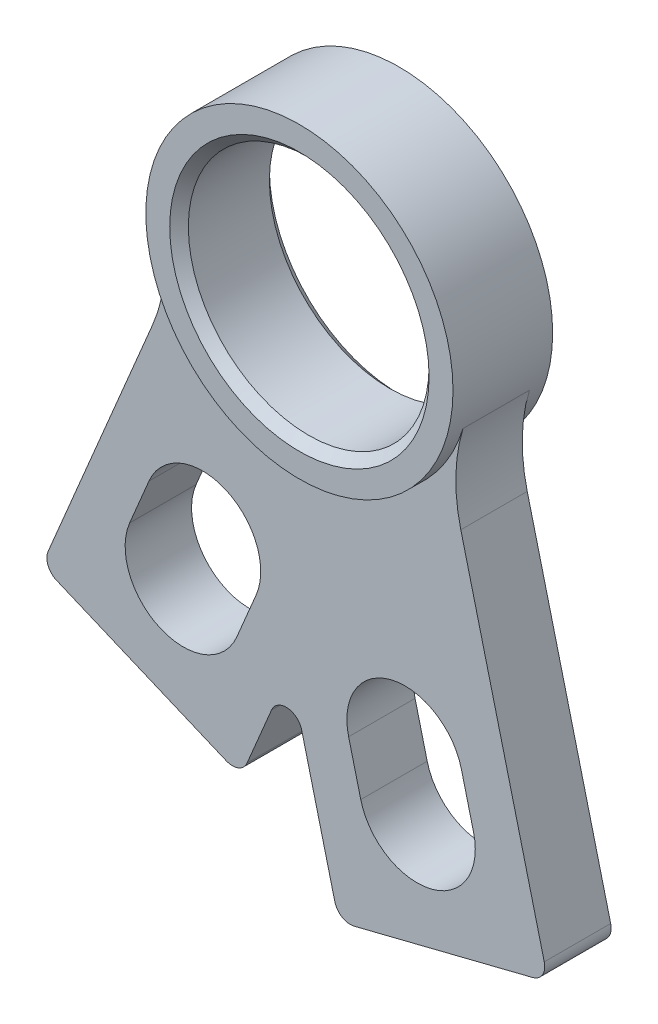
ISO-10303-21;
HEADER;
FILE_DESCRIPTION(('STEP AP214'),'2;1');
FILE_NAME('part.step','',(''),(''),'','','');
FILE_SCHEMA(('AUTOMOTIVE_DESIGN { 1 0 10303 214 1 1 1 1 }'));
ENDSEC;
DATA;
#1=APPLICATION_CONTEXT('core data for automotive mechanical design processes');
#2=APPLICATION_PROTOCOL_DEFINITION('international standard','automotive_design',2000,#1);
#3=PRODUCT_CONTEXT('',#1,'mechanical');
#4=PRODUCT('Part','Part','',(#3));
#5=PRODUCT_RELATED_PRODUCT_CATEGORY('part','',(#4));
#6=PRODUCT_DEFINITION_FORMATION('','',#4);
#7=PRODUCT_DEFINITION_CONTEXT('part definition',#1,'design');
#8=PRODUCT_DEFINITION('design','',#6,#7);
#9=PRODUCT_DEFINITION_SHAPE('','',#8);
#10=(LENGTH_UNIT() NAMED_UNIT(*) SI_UNIT(.MILLI.,.METRE.));
#11=(NAMED_UNIT(*) PLANE_ANGLE_UNIT() SI_UNIT($,.RADIAN.));
#12=(NAMED_UNIT(*) SI_UNIT($,.STERADIAN.) SOLID_ANGLE_UNIT());
#13=UNCERTAINTY_MEASURE_WITH_UNIT(LENGTH_MEASURE(1.E-05),#10,'distance_accuracy_value','');
#14=(GEOMETRIC_REPRESENTATION_CONTEXT(3) GLOBAL_UNCERTAINTY_ASSIGNED_CONTEXT((#13)) GLOBAL_UNIT_ASSIGNED_CONTEXT((#10,
#11,#12)) REPRESENTATION_CONTEXT('',''));
#15=CARTESIAN_POINT('',(0.,0.,0.));
#16=DIRECTION('',(0.,0.,1.));
#17=DIRECTION('',(1.,0.,0.));
#18=AXIS2_PLACEMENT_3D('',#15,#16,#17);
#19=CARTESIAN_POINT('',(0.,0.,4.7625));
#20=DIRECTION('',(0.,0.,-1.));
#21=DIRECTION('',(-1.,0.,0.));
#22=AXIS2_PLACEMENT_3D('',#19,#20,#21);
#23=CYLINDRICAL_SURFACE('',#22,11.5062);
#24=CARTESIAN_POINT('',(0.,0.,-3.87350000000002));
#25=DIRECTION('',(0.,0.,1.));
#26=DIRECTION('',(1.,0.,0.));
#27=AXIS2_PLACEMENT_3D('',#24,#25,#26);
#28=CIRCLE('',#27,11.5062);
#29=CARTESIAN_POINT('',(-11.5062,0.,-3.87350000000002));
#30=VERTEX_POINT('',#29);
#31=EDGE_CURVE('E42',#30,#30,#28,.F.);
#32=CARTESIAN_POINT('',(0.,0.,3.87349999999996));
#33=DIRECTION('',(0.,0.,1.));
#34=DIRECTION('',(1.,0.,0.));
#35=AXIS2_PLACEMENT_3D('',#32,#33,#34);
#36=CIRCLE('',#35,11.5062);
#37=CARTESIAN_POINT('',(-11.5062,0.,3.87349999999996));
#38=VERTEX_POINT('',#37);
#39=EDGE_CURVE('E369',#38,#38,#36,.T.);
#40=CARTESIAN_POINT('',(-11.5062,0.,-3.87350000000002));
#41=CARTESIAN_POINT('',(-11.5062,0.,-3.79280208333335));
#42=CARTESIAN_POINT('',(-11.5062,0.,-3.71210416666669));
#43=CARTESIAN_POINT('',(-11.5062,0.,-3.55070833333335));
#44=CARTESIAN_POINT('',(-11.5062,0.,-3.47001041666669));
#45=CARTESIAN_POINT('',(-11.5062,0.,-3.30861458333335));
#46=CARTESIAN_POINT('',(-11.5062,0.,-3.22791666666669));
#47=CARTESIAN_POINT('',(-11.5062,0.,-3.06652083333336));
#48=CARTESIAN_POINT('',(-11.5062,0.,-2.98582291666669));
#49=CARTESIAN_POINT('',(-11.5062,0.,-2.82442708333336));
#50=CARTESIAN_POINT('',(-11.5062,0.,-2.74372916666669));
#51=CARTESIAN_POINT('',(-11.5062,0.,-2.58233333333336));
#52=CARTESIAN_POINT('',(-11.5062,0.,-2.50163541666669));
#53=CARTESIAN_POINT('',(-11.5062,0.,-2.34023958333336));
#54=CARTESIAN_POINT('',(-11.5062,0.,-2.25954166666669));
#55=CARTESIAN_POINT('',(-11.5062,0.,-2.09814583333336));
#56=CARTESIAN_POINT('',(-11.5062,0.,-2.01744791666669));
#57=CARTESIAN_POINT('',(-11.5062,0.,-1.85605208333336));
#58=CARTESIAN_POINT('',(-11.5062,0.,-1.77535416666669));
#59=CARTESIAN_POINT('',(-11.5062,0.,-1.61395833333336));
#60=CARTESIAN_POINT('',(-11.5062,0.,-1.53326041666669));
#61=CARTESIAN_POINT('',(-11.5062,0.,-1.37186458333336));
#62=CARTESIAN_POINT('',(-11.5062,0.,-1.29116666666669));
#63=CARTESIAN_POINT('',(-11.5062,0.,-1.12977083333336));
#64=CARTESIAN_POINT('',(-11.5062,0.,-1.04907291666669));
#65=CARTESIAN_POINT('',(-11.5062,0.,-0.88767708333336));
#66=CARTESIAN_POINT('',(-11.5062,0.,-0.806979166666694));
#67=CARTESIAN_POINT('',(-11.5062,0.,-0.645583333333361));
#68=CARTESIAN_POINT('',(-11.5062,0.,-0.564885416666694));
#69=CARTESIAN_POINT('',(-11.5062,0.,-0.403489583333361));
#70=CARTESIAN_POINT('',(-11.5062,0.,-0.322791666666695));
#71=CARTESIAN_POINT('',(-11.5062,0.,-0.161395833333361));
#72=CARTESIAN_POINT('',(-11.5062,0.,-0.080697916666695));
#73=CARTESIAN_POINT('',(-11.5062,0.,0.0806979166666378));
#74=CARTESIAN_POINT('',(-11.5062,0.,0.161395833333304));
#75=CARTESIAN_POINT('',(-11.5062,0.,0.322791666666637));
#76=CARTESIAN_POINT('',(-11.5062,0.,0.403489583333304));
#77=CARTESIAN_POINT('',(-11.5062,0.,0.564885416666637));
#78=CARTESIAN_POINT('',(-11.5062,0.,0.645583333333304));
#79=CARTESIAN_POINT('',(-11.5062,0.,0.806979166666636));
#80=CARTESIAN_POINT('',(-11.5062,0.,0.887677083333303));
#81=CARTESIAN_POINT('',(-11.5062,0.,1.04907291666664));
#82=CARTESIAN_POINT('',(-11.5062,0.,1.1297708333333));
#83=CARTESIAN_POINT('',(-11.5062,0.,1.29116666666664));
#84=CARTESIAN_POINT('',(-11.5062,0.,1.3718645833333));
#85=CARTESIAN_POINT('',(-11.5062,0.,1.53326041666663));
#86=CARTESIAN_POINT('',(-11.5062,0.,1.6139583333333));
#87=CARTESIAN_POINT('',(-11.5062,0.,1.77535416666663));
#88=CARTESIAN_POINT('',(-11.5062,0.,1.8560520833333));
#89=CARTESIAN_POINT('',(-11.5062,0.,2.01744791666663));
#90=CARTESIAN_POINT('',(-11.5062,0.,2.0981458333333));
#91=CARTESIAN_POINT('',(-11.5062,0.,2.25954166666663));
#92=CARTESIAN_POINT('',(-11.5062,0.,2.3402395833333));
#93=CARTESIAN_POINT('',(-11.5062,0.,2.50163541666663));
#94=CARTESIAN_POINT('',(-11.5062,0.,2.5823333333333));
#95=CARTESIAN_POINT('',(-11.5062,0.,2.74372916666663));
#96=CARTESIAN_POINT('',(-11.5062,0.,2.8244270833333));
#97=CARTESIAN_POINT('',(-11.5062,0.,2.98582291666663));
#98=CARTESIAN_POINT('',(-11.5062,0.,3.0665208333333));
#99=CARTESIAN_POINT('',(-11.5062,0.,3.22791666666663));
#100=CARTESIAN_POINT('',(-11.5062,0.,3.3086145833333));
#101=CARTESIAN_POINT('',(-11.5062,0.,3.47001041666663));
#102=CARTESIAN_POINT('',(-11.5062,0.,3.5507083333333));
#103=CARTESIAN_POINT('',(-11.5062,0.,3.71210416666663));
#104=CARTESIAN_POINT('',(-11.5062,0.,3.7928020833333));
#105=CARTESIAN_POINT('',(-11.5062,0.,3.87349999999996));
#106=B_SPLINE_CURVE_WITH_KNOTS('',3,(#40,#41,#42,#43,#44,#45,#46,#47,#48,#49,#50,#51,#52,#53,
#54,#55,#56,#57,#58,#59,#60,#61,#62,#63,#64,#65,#66,#67,#68,#69,#70,#71,#72,#73,#74,#75,#76,#77,
#78,#79,#80,#81,#82,#83,#84,#85,#86,#87,#88,#89,#90,#91,#92,#93,#94,#95,#96,#97,#98,#99,#100,
#101,#102,#103,#104,#105),.UNSPECIFIED.,.F.,.F.,(4,2,2,2,2,2,2,2,2,2,2,2,2,2,2,2,2,2,2,2,2,2,2,
2,2,2,2,2,2,2,2,2,4),(0.,0.24209375,0.484187499999998,0.726281249999999,0.968374999999997,
1.21046875,1.4525625,1.69465625,1.93674999999999,2.17884375,2.42093749999999,2.66303124999999,
2.90512499999999,3.14721874999999,3.38931249999999,3.63140624999999,3.87349999999999,
4.11559374999999,4.35768749999999,4.59978124999999,4.84187499999999,5.08396874999999,
5.32606249999999,5.56815624999999,5.81024999999999,6.05234374999999,6.29443749999999,
6.53653124999999,6.77862499999998,7.02071874999998,7.26281249999998,7.50490624999998,
7.74699999999998),.UNSPECIFIED.);
#107=EDGE_CURVE('BSEAM34',#30,#38,#106,.T.);
#108=ORIENTED_EDGE('',*,*,#31,.T.);
#109=ORIENTED_EDGE('',*,*,#39,.T.);
#110=ORIENTED_EDGE('',*,*,#107,.T.);
#111=ORIENTED_EDGE('',*,*,#107,.F.);
#112=EDGE_LOOP('',(#108,#110,#109,#111));
#113=FACE_BOUND('',#112,.T.);
#114=ADVANCED_FACE('F34',(#113),#23,.F.);
#115=CARTESIAN_POINT('',(0.,0.,4.7625));
#116=DIRECTION('',(0.,0.,-1.));
#117=DIRECTION('',(-1.,0.,0.));
#118=AXIS2_PLACEMENT_3D('',#115,#116,#117);
#119=CYLINDRICAL_SURFACE('',#118,14.6812);
#120=DIRECTION('',(0.,0.,-1.));
#121=VECTOR('',#120,1.);
#122=CARTESIAN_POINT('',(-14.532047586715,-2.08739703397579,3.175));
#123=LINE('',#122,#121);
#124=CARTESIAN_POINT('',(-14.532047586715,-2.0873970339758,3.175));
#125=VERTEX_POINT('',#124);
#126=CARTESIAN_POINT('',(-14.532047586715,-2.08739703397579,-3.175));
#127=VERTEX_POINT('',#126);
#128=EDGE_CURVE('E196',#125,#127,#123,.T.);
#129=ORIENTED_EDGE('',*,*,#128,.F.);
#130=CARTESIAN_POINT('',(0.,0.,3.175));
#131=DIRECTION('',(0.,0.,1.));
#132=DIRECTION('',(1.,0.,0.));
#133=AXIS2_PLACEMENT_3D('',#130,#131,#132);
#134=CIRCLE('',#133,14.6812);
#135=CARTESIAN_POINT('',(14.0468394014774,-4.26895025376291,3.175));
#136=VERTEX_POINT('',#135);
#137=EDGE_CURVE('E212',#125,#136,#134,.T.);
#138=ORIENTED_EDGE('',*,*,#137,.T.);
#139=DIRECTION('',(0.,0.,-1.));
#140=VECTOR('',#139,1.);
#141=CARTESIAN_POINT('',(14.0468394014774,-4.26895025376291,3.175));
#142=LINE('',#141,#140);
#143=CARTESIAN_POINT('',(14.0468394014774,-4.26895025376291,-3.175));
#144=VERTEX_POINT('',#143);
#145=EDGE_CURVE('E252',#136,#144,#142,.T.);
#146=ORIENTED_EDGE('',*,*,#145,.T.);
#147=CARTESIAN_POINT('',(0.,0.,-3.175));
#148=DIRECTION('',(0.,0.,1.));
#149=DIRECTION('',(1.,0.,0.));
#150=AXIS2_PLACEMENT_3D('',#147,#148,#149);
#151=CIRCLE('',#150,14.6812);
#152=EDGE_CURVE('E253',#127,#144,#151,.T.);
#153=ORIENTED_EDGE('',*,*,#152,.F.);
#154=EDGE_LOOP('',(#129,#138,#146,#153));
#155=FACE_BOUND('',#154,.T.);
#156=CARTESIAN_POINT('',(0.,0.,4.7625));
#157=DIRECTION('',(0.,0.,1.));
#158=DIRECTION('',(1.,0.,0.));
#159=AXIS2_PLACEMENT_3D('',#156,#157,#158);
#160=CIRCLE('',#159,14.6812);
#161=CARTESIAN_POINT('',(14.6812,0.,4.7625));
#162=VERTEX_POINT('',#161);
#163=EDGE_CURVE('E319',#162,#162,#160,.T.);
#164=ORIENTED_EDGE('',*,*,#163,.F.);
#165=EDGE_LOOP('',(#164));
#166=FACE_BOUND('',#165,.T.);
#167=CARTESIAN_POINT('',(0.,0.,-4.7625));
#168=DIRECTION('',(0.,0.,1.));
#169=DIRECTION('',(1.,0.,0.));
#170=AXIS2_PLACEMENT_3D('',#167,#168,#169);
#171=CIRCLE('',#170,14.6812);
#172=CARTESIAN_POINT('',(14.6812,0.,-4.7625));
#173=VERTEX_POINT('',#172);
#174=EDGE_CURVE('E307',#173,#173,#171,.T.);
#175=ORIENTED_EDGE('',*,*,#174,.T.);
#176=EDGE_LOOP('',(#175));
#177=FACE_BOUND('',#176,.T.);
#178=ADVANCED_FACE('F390',(#155,#166,#177),#119,.T.);
#179=CARTESIAN_POINT('',(0.,0.,4.7625));
#180=DIRECTION('',(0.,0.,1.));
#181=DIRECTION('',(1.,0.,0.));
#182=AXIS2_PLACEMENT_3D('',#179,#180,#181);
#183=PLANE('',#182);
#184=CARTESIAN_POINT('',(0.,0.,4.7625));
#185=DIRECTION('',(0.,0.,1.));
#186=DIRECTION('',(1.,0.,0.));
#187=AXIS2_PLACEMENT_3D('',#184,#185,#186);
#188=CIRCLE('',#187,12.3952);
#189=CARTESIAN_POINT('',(12.3952,0.,4.7625));
#190=VERTEX_POINT('',#189);
#191=EDGE_CURVE('E11',#190,#190,#188,.F.);
#192=ORIENTED_EDGE('',*,*,#191,.T.);
#193=EDGE_LOOP('',(#192));
#194=FACE_BOUND('',#193,.T.);
#195=ORIENTED_EDGE('',*,*,#163,.T.);
#196=EDGE_LOOP('',(#195));
#197=FACE_BOUND('',#196,.T.);
#198=ADVANCED_FACE('F386',(#194,#197),#183,.T.);
#199=CARTESIAN_POINT('',(0.,0.,-4.7625));
#200=DIRECTION('',(0.,0.,1.));
#201=DIRECTION('',(1.,0.,0.));
#202=AXIS2_PLACEMENT_3D('',#199,#200,#201);
#203=PLANE('',#202);
#204=CARTESIAN_POINT('',(0.,0.,-4.7625));
#205=DIRECTION('',(0.,0.,1.));
#206=DIRECTION('',(1.,0.,0.));
#207=AXIS2_PLACEMENT_3D('',#204,#205,#206);
#208=CIRCLE('',#207,12.3952);
#209=CARTESIAN_POINT('',(-12.3952,0.,-4.7625));
#210=VERTEX_POINT('',#209);
#211=EDGE_CURVE('E366',#210,#210,#208,.T.);
#212=ORIENTED_EDGE('',*,*,#211,.T.);
#213=EDGE_LOOP('',(#212));
#214=FACE_BOUND('',#213,.T.);
#215=ORIENTED_EDGE('',*,*,#174,.F.);
#216=EDGE_LOOP('',(#215));
#217=FACE_BOUND('',#216,.T.);
#218=ADVANCED_FACE('F382',(#214,#217),#203,.F.);
#219=CARTESIAN_POINT('',(-10.842600348288,-25.7699764122771,3.175));
#220=DIRECTION('',(0.,0.,-1.));
#221=DIRECTION('',(-1.,0.,0.));
#222=AXIS2_PLACEMENT_3D('',#219,#220,#221);
#223=CYLINDRICAL_SURFACE('',#222,5.55624999999843);
#224=CARTESIAN_POINT('',(-10.842600348288,-25.7699764122771,-3.175));
#225=DIRECTION('',(0.,0.,1.));
#226=DIRECTION('',(1.,0.,0.));
#227=AXIS2_PLACEMENT_3D('',#224,#225,#226);
#228=CIRCLE('',#227,5.55624999999843);
#229=CARTESIAN_POINT('',(-5.72120132124268,-27.9247817557507,-3.175));
#230=VERTEX_POINT('',#229);
#231=CARTESIAN_POINT('',(-15.9639993753332,-23.6151710688035,-3.175));
#232=VERTEX_POINT('',#231);
#233=EDGE_CURVE('E287',#230,#232,#228,.T.);
#234=ORIENTED_EDGE('',*,*,#233,.F.);
#235=DIRECTION('',(0.,0.,-1.));
#236=VECTOR('',#235,1.);
#237=CARTESIAN_POINT('',(-5.72120132124268,-27.9247817557507,3.175));
#238=LINE('',#237,#236);
#239=CARTESIAN_POINT('',(-5.72120132124268,-27.9247817557507,3.175));
#240=VERTEX_POINT('',#239);
#241=EDGE_CURVE('E305',#240,#230,#238,.T.);
#242=ORIENTED_EDGE('',*,*,#241,.F.);
#243=CARTESIAN_POINT('',(-10.842600348288,-25.7699764122771,3.175));
#244=DIRECTION('',(0.,0.,1.));
#245=DIRECTION('',(1.,0.,0.));
#246=AXIS2_PLACEMENT_3D('',#243,#244,#245);
#247=CIRCLE('',#246,5.55624999999843);
#248=CARTESIAN_POINT('',(-15.9639993753332,-23.6151710688035,3.175));
#249=VERTEX_POINT('',#248);
#250=EDGE_CURVE('E241',#240,#249,#247,.T.);
#251=ORIENTED_EDGE('',*,*,#250,.T.);
#252=DIRECTION('',(0.,0.,-1.));
#253=VECTOR('',#252,1.);
#254=CARTESIAN_POINT('',(-15.9639993753332,-23.6151710688035,3.175));
#255=LINE('',#254,#253);
#256=EDGE_CURVE('E298',#249,#232,#255,.T.);
#257=ORIENTED_EDGE('',*,*,#256,.T.);
#258=EDGE_LOOP('',(#234,#242,#251,#257));
#259=FACE_BOUND('',#258,.T.);
#260=ADVANCED_FACE('F385',(#259),#223,.F.);
#261=CARTESIAN_POINT('',(5.12139902704526,-2.15480534347357,3.175));
#262=DIRECTION('',(-0.921736607792436,0.387816484764757,0.));
#263=DIRECTION('',(-0.387816484764757,-0.921736607792436,0.));
#264=AXIS2_PLACEMENT_3D('',#261,#262,#263);
#265=PLANE('',#264);
#266=DIRECTION('',(0.387816484764757,0.921736607792436,0.));
#267=VECTOR('',#266,1.);
#268=CARTESIAN_POINT('',(5.12139902704526,-2.15480534347357,-3.175));
#269=LINE('',#268,#267);
#270=CARTESIAN_POINT('',(-7.56817732993608,-32.3145523503651,-3.175));
#271=VERTEX_POINT('',#270);
#272=EDGE_CURVE('E290',#271,#230,#269,.T.);
#273=ORIENTED_EDGE('',*,*,#272,.F.);
#274=DIRECTION('',(0.,0.,-1.));
#275=VECTOR('',#274,1.);
#276=CARTESIAN_POINT('',(-7.56817732993608,-32.3145523503651,3.175));
#277=LINE('',#276,#275);
#278=CARTESIAN_POINT('',(-7.56817732993608,-32.3145523503651,3.175));
#279=VERTEX_POINT('',#278);
#280=EDGE_CURVE('E303',#279,#271,#277,.T.);
#281=ORIENTED_EDGE('',*,*,#280,.F.);
#282=DIRECTION('',(0.387816484764757,0.921736607792436,0.));
#283=VECTOR('',#282,1.);
#284=CARTESIAN_POINT('',(5.12139902704526,-2.15480534347357,3.175));
#285=LINE('',#284,#283);
#286=EDGE_CURVE('E244',#279,#240,#285,.T.);
#287=ORIENTED_EDGE('',*,*,#286,.T.);
#288=ORIENTED_EDGE('',*,*,#241,.T.);
#289=EDGE_LOOP('',(#273,#281,#287,#288));
#290=FACE_BOUND('',#289,.T.);
#291=ADVANCED_FACE('F529',(#290),#265,.T.);
#292=CARTESIAN_POINT('',(-12.6895763569814,-30.1597470068915,3.175));
#293=DIRECTION('',(0.,0.,-1.));
#294=DIRECTION('',(-1.,0.,0.));
#295=AXIS2_PLACEMENT_3D('',#292,#293,#294);
#296=CYLINDRICAL_SURFACE('',#295,5.55624999999843);
#297=CARTESIAN_POINT('',(-12.6895763569814,-30.1597470068915,-3.175));
#298=DIRECTION('',(0.,0.,1.));
#299=DIRECTION('',(1.,0.,0.));
#300=AXIS2_PLACEMENT_3D('',#297,#298,#299);
#301=CIRCLE('',#300,5.55624999999843);
#302=CARTESIAN_POINT('',(-17.8109753840266,-28.004941663418,-3.175));
#303=VERTEX_POINT('',#302);
#304=EDGE_CURVE('E293',#303,#271,#301,.T.);
#305=ORIENTED_EDGE('',*,*,#304,.F.);
#306=DIRECTION('',(0.,0.,-1.));
#307=VECTOR('',#306,1.);
#308=CARTESIAN_POINT('',(-17.8109753840266,-28.004941663418,3.175));
#309=LINE('',#308,#307);
#310=CARTESIAN_POINT('',(-17.8109753840266,-28.004941663418,3.175));
#311=VERTEX_POINT('',#310);
#312=EDGE_CURVE('E300',#311,#303,#309,.T.);
#313=ORIENTED_EDGE('',*,*,#312,.F.);
#314=CARTESIAN_POINT('',(-12.6895763569814,-30.1597470068915,3.175));
#315=DIRECTION('',(0.,0.,1.));
#316=DIRECTION('',(1.,0.,0.));
#317=AXIS2_PLACEMENT_3D('',#314,#315,#316);
#318=CIRCLE('',#317,5.55624999999843);
#319=EDGE_CURVE('E247',#311,#279,#318,.T.);
#320=ORIENTED_EDGE('',*,*,#319,.T.);
#321=ORIENTED_EDGE('',*,*,#280,.T.);
#322=EDGE_LOOP('',(#305,#313,#320,#321));
#323=FACE_BOUND('',#322,.T.);
#324=ADVANCED_FACE('F496',(#323),#296,.F.);
#325=CARTESIAN_POINT('',(8.50576616123908,-33.8920354749235,3.175));
#326=DIRECTION('',(0.,0.,-1.));
#327=DIRECTION('',(-1.,0.,0.));
#328=AXIS2_PLACEMENT_3D('',#325,#326,#327);
#329=CYLINDRICAL_SURFACE('',#328,5.55624999999839);
#330=CARTESIAN_POINT('',(8.50576616123908,-33.8920354749235,-3.175));
#331=DIRECTION('',(0.,0.,1.));
#332=DIRECTION('',(1.,0.,0.));
#333=AXIS2_PLACEMENT_3D('',#330,#331,#332);
#334=CIRCLE('',#333,5.55624999999839);
#335=CARTESIAN_POINT('',(13.8948926237408,-32.5395451667713,-3.175));
#336=VERTEX_POINT('',#335);
#337=CARTESIAN_POINT('',(3.11663969873735,-35.2445257830757,-3.175));
#338=VERTEX_POINT('',#337);
#339=EDGE_CURVE('E275',#336,#338,#334,.T.);
#340=ORIENTED_EDGE('',*,*,#339,.F.);
#341=DIRECTION('',(0.,0.,-1.));
#342=VECTOR('',#341,1.);
#343=CARTESIAN_POINT('',(13.8948926237408,-32.5395451667713,3.175));
#344=LINE('',#343,#342);
#345=CARTESIAN_POINT('',(13.8948926237408,-32.5395451667713,3.175));
#346=VERTEX_POINT('',#345);
#347=EDGE_CURVE('E301',#346,#336,#344,.T.);
#348=ORIENTED_EDGE('',*,*,#347,.F.);
#349=CARTESIAN_POINT('',(8.50576616123908,-33.8920354749235,3.175));
#350=DIRECTION('',(0.,0.,1.));
#351=DIRECTION('',(1.,0.,0.));
#352=AXIS2_PLACEMENT_3D('',#349,#350,#351);
#353=CIRCLE('',#352,5.55624999999839);
#354=CARTESIAN_POINT('',(3.11663969873735,-35.2445257830757,3.175));
#355=VERTEX_POINT('',#354);
#356=EDGE_CURVE('E230',#346,#355,#353,.T.);
#357=ORIENTED_EDGE('',*,*,#356,.T.);
#358=DIRECTION('',(0.,0.,-1.));
#359=VECTOR('',#358,1.);
#360=CARTESIAN_POINT('',(3.11663969873735,-35.2445257830757,3.175));
#361=LINE('',#360,#359);
#362=EDGE_CURVE('E308',#355,#338,#361,.T.);
#363=ORIENTED_EDGE('',*,*,#362,.T.);
#364=EDGE_LOOP('',(#340,#348,#357,#363));
#365=FACE_BOUND('',#364,.T.);
#366=ADVANCED_FACE('F488',(#365),#329,.F.);
#367=CARTESIAN_POINT('',(5.38912646250172,1.35249030815222,3.175));
#368=DIRECTION('',(-0.96992152306021,-0.243417828238941,0.));
#369=DIRECTION('',(0.243417828238941,-0.96992152306021,0.));
#370=AXIS2_PLACEMENT_3D('',#367,#368,#369);
#371=PLANE('',#370);
#372=DIRECTION('',(-0.243417828238941,0.96992152306021,0.));
#373=VECTOR('',#372,1.);
#374=CARTESIAN_POINT('',(5.38912646250172,1.35249030815222,-3.175));
#375=LINE('',#374,#373);
#376=CARTESIAN_POINT('',(15.0541700307295,-37.1587964203486,-3.175));
#377=VERTEX_POINT('',#376);
#378=EDGE_CURVE('E278',#377,#336,#375,.T.);
#379=ORIENTED_EDGE('',*,*,#378,.F.);
#380=DIRECTION('',(0.,0.,-1.));
#381=VECTOR('',#380,1.);
#382=CARTESIAN_POINT('',(15.0541700307295,-37.1587964203486,3.175));
#383=LINE('',#382,#381);
#384=CARTESIAN_POINT('',(15.0541700307295,-37.1587964203486,3.175));
#385=VERTEX_POINT('',#384);
#386=EDGE_CURVE('E312',#385,#377,#383,.T.);
#387=ORIENTED_EDGE('',*,*,#386,.F.);
#388=DIRECTION('',(-0.243417828238941,0.96992152306021,0.));
#389=VECTOR('',#388,1.);
#390=CARTESIAN_POINT('',(5.38912646250172,1.35249030815222,3.175));
#391=LINE('',#390,#389);
#392=EDGE_CURVE('E233',#385,#346,#391,.T.);
#393=ORIENTED_EDGE('',*,*,#392,.T.);
#394=ORIENTED_EDGE('',*,*,#347,.T.);
#395=EDGE_LOOP('',(#379,#387,#393,#394));
#396=FACE_BOUND('',#395,.T.);
#397=ADVANCED_FACE('F482',(#396),#371,.T.);
#398=CARTESIAN_POINT('',(9.66504356822784,-38.5112867285008,3.175));
#399=DIRECTION('',(0.,0.,-1.));
#400=DIRECTION('',(-1.,0.,0.));
#401=AXIS2_PLACEMENT_3D('',#398,#399,#400);
#402=CYLINDRICAL_SURFACE('',#401,5.55624999999839);
#403=CARTESIAN_POINT('',(9.66504356822784,-38.5112867285008,-3.175));
#404=DIRECTION('',(0.,0.,1.));
#405=DIRECTION('',(1.,0.,0.));
#406=AXIS2_PLACEMENT_3D('',#403,#404,#405);
#407=CIRCLE('',#406,5.55624999999839);
#408=CARTESIAN_POINT('',(4.27591710572608,-39.8637770366531,-3.175));
#409=VERTEX_POINT('',#408);
#410=EDGE_CURVE('E281',#409,#377,#407,.T.);
#411=ORIENTED_EDGE('',*,*,#410,.F.);
#412=DIRECTION('',(0.,0.,-1.));
#413=VECTOR('',#412,1.);
#414=CARTESIAN_POINT('',(4.27591710572608,-39.8637770366531,3.175));
#415=LINE('',#414,#413);
#416=CARTESIAN_POINT('',(4.27591710572608,-39.8637770366531,3.175));
#417=VERTEX_POINT('',#416);
#418=EDGE_CURVE('E310',#417,#409,#415,.T.);
#419=ORIENTED_EDGE('',*,*,#418,.F.);
#420=CARTESIAN_POINT('',(9.66504356822784,-38.5112867285008,3.175));
#421=DIRECTION('',(0.,0.,1.));
#422=DIRECTION('',(1.,0.,0.));
#423=AXIS2_PLACEMENT_3D('',#420,#421,#422);
#424=CIRCLE('',#423,5.55624999999839);
#425=EDGE_CURVE('E236',#417,#385,#424,.T.);
#426=ORIENTED_EDGE('',*,*,#425,.T.);
#427=ORIENTED_EDGE('',*,*,#386,.T.);
#428=EDGE_LOOP('',(#411,#419,#426,#427));
#429=FACE_BOUND('',#428,.T.);
#430=ADVANCED_FACE('F478',(#429),#402,.F.);
#431=CARTESIAN_POINT('',(-30.2457668630056,-4.34453050497017,3.175));
#432=DIRECTION('',(0.,0.,-1.));
#433=DIRECTION('',(-1.,0.,0.));
#434=AXIS2_PLACEMENT_3D('',#431,#432,#433);
#435=CYLINDRICAL_SURFACE('',#434,15.8749999999984);
#436=CARTESIAN_POINT('',(-30.2457668630056,-4.34453050497017,-3.175));
#437=DIRECTION('',(0.,0.,1.));
#438=DIRECTION('',(1.,0.,0.));
#439=AXIS2_PLACEMENT_3D('',#436,#437,#438);
#440=CIRCLE('',#439,15.8749999999984);
#441=CARTESIAN_POINT('',(-15.6131982143021,-10.5011172006101,-3.175));
#442=VERTEX_POINT('',#441);
#443=EDGE_CURVE('E192',#442,#127,#440,.T.);
#444=ORIENTED_EDGE('',*,*,#443,.F.);
#445=DIRECTION('',(0.,0.,-1.));
#446=VECTOR('',#445,1.);
#447=CARTESIAN_POINT('',(-15.6131982143021,-10.5011172006101,3.175));
#448=LINE('',#447,#446);
#449=CARTESIAN_POINT('',(-15.6131982143021,-10.5011172006101,3.175));
#450=VERTEX_POINT('',#449);
#451=EDGE_CURVE('E185',#450,#442,#448,.T.);
#452=ORIENTED_EDGE('',*,*,#451,.F.);
#453=CARTESIAN_POINT('',(-30.2457668630056,-4.34453050497017,3.175));
#454=DIRECTION('',(0.,0.,1.));
#455=DIRECTION('',(1.,0.,0.));
#456=AXIS2_PLACEMENT_3D('',#453,#454,#455);
#457=CIRCLE('',#456,15.8749999999984);
#458=EDGE_CURVE('E190',#450,#125,#457,.T.);
#459=ORIENTED_EDGE('',*,*,#458,.T.);
#460=ORIENTED_EDGE('',*,*,#128,.T.);
#461=EDGE_LOOP('',(#444,#452,#459,#460));
#462=FACE_BOUND('',#461,.T.);
#463=ADVANCED_FACE('F187',(#462),#435,.F.);
#464=CARTESIAN_POINT('',(-9.51116962165673,4.00178135216573,3.175));
#465=DIRECTION('',(0.921736607792436,-0.387816484764758,0.));
#466=DIRECTION('',(0.387816484764758,0.921736607792436,0.));
#467=AXIS2_PLACEMENT_3D('',#464,#465,#466);
#468=PLANE('',#467);
#469=DIRECTION('',(-0.387816484764758,-0.921736607792436,0.));
#470=VECTOR('',#469,1.);
#471=CARTESIAN_POINT('',(-9.51116962165673,4.00178135216573,-3.175));
#472=LINE('',#471,#470);
#473=CARTESIAN_POINT('',(-25.6114950080223,-34.2644086861069,-3.175));
#474=VERTEX_POINT('',#473);
#475=EDGE_CURVE('E257',#442,#474,#472,.T.);
#476=ORIENTED_EDGE('',*,*,#475,.T.);
#477=DIRECTION('',(0.,0.,-1.));
#478=VECTOR('',#477,1.);
#479=CARTESIAN_POINT('',(-25.6114950080223,-34.2644086861068,3.175));
#480=LINE('',#479,#478);
#481=CARTESIAN_POINT('',(-25.6114950080223,-34.2644086861069,3.175));
#482=VERTEX_POINT('',#481);
#483=EDGE_CURVE('E203',#474,#482,#480,.F.);
#484=ORIENTED_EDGE('',*,*,#483,.T.);
#485=DIRECTION('',(-0.387816484764758,-0.921736607792436,0.));
#486=VECTOR('',#485,1.);
#487=CARTESIAN_POINT('',(-9.51116962165673,4.00178135216573,3.175));
#488=LINE('',#487,#486);
#489=EDGE_CURVE('E200',#450,#482,#488,.T.);
#490=ORIENTED_EDGE('',*,*,#489,.F.);
#491=ORIENTED_EDGE('',*,*,#451,.T.);
#492=EDGE_LOOP('',(#476,#484,#490,#491));
#493=FACE_BOUND('',#492,.T.);
#494=ADVANCED_FACE('F201',(#493),#468,.F.);
#495=CARTESIAN_POINT('',(-16.691357709147,-39.6709166285483,3.175));
#496=DIRECTION('',(0.387816484764755,0.921736607792437,0.));
#497=DIRECTION('',(-0.921736607792437,0.387816484764755,0.));
#498=AXIS2_PLACEMENT_3D('',#495,#496,#497);
#499=PLANE('',#498);
#500=DIRECTION('',(0.921736607792437,-0.387816484764755,0.));
#501=VECTOR('',#500,1.);
#502=CARTESIAN_POINT('',(-16.691357709147,-39.6709166285483,-3.175));
#503=LINE('',#502,#501);
#504=CARTESIAN_POINT('',(-24.7978007405281,-36.260167599164,-3.175));
#505=VERTEX_POINT('',#504);
#506=CARTESIAN_POINT('',(-8.58491467776602,-43.0816656579324,-3.175));
#507=VERTEX_POINT('',#506);
#508=EDGE_CURVE('E259',#505,#507,#503,.T.);
#509=ORIENTED_EDGE('',*,*,#508,.T.);
#510=DIRECTION('',(0.,0.,-1.));
#511=VECTOR('',#510,1.);
#512=CARTESIAN_POINT('',(-8.58491467776603,-43.0816656579324,3.175));
#513=LINE('',#512,#511);
#514=CARTESIAN_POINT('',(-8.58491467776602,-43.0816656579324,3.175));
#515=VERTEX_POINT('',#514);
#516=EDGE_CURVE('E340',#507,#515,#513,.F.);
#517=ORIENTED_EDGE('',*,*,#516,.T.);
#518=DIRECTION('',(0.921736607792437,-0.387816484764755,0.));
#519=VECTOR('',#518,1.);
#520=CARTESIAN_POINT('',(-16.691357709147,-39.6709166285483,3.175));
#521=LINE('',#520,#519);
#522=CARTESIAN_POINT('',(-24.7978007405281,-36.260167599164,3.175));
#523=VERTEX_POINT('',#522);
#524=EDGE_CURVE('E205',#523,#515,#521,.T.);
#525=ORIENTED_EDGE('',*,*,#524,.F.);
#526=DIRECTION('',(0.,0.,-1.));
#527=VECTOR('',#526,1.);
#528=CARTESIAN_POINT('',(-24.7978007405281,-36.260167599164,3.175));
#529=LINE('',#528,#527);
#530=EDGE_CURVE('E337',#523,#505,#529,.T.);
#531=ORIENTED_EDGE('',*,*,#530,.T.);
#532=EDGE_LOOP('',(#509,#517,#525,#531));
#533=FACE_BOUND('',#532,.T.);
#534=ADVANCED_FACE('F442',(#533),#499,.F.);
#535=CARTESIAN_POINT('',(9.51116962165669,-4.00178135216571,3.175));
#536=DIRECTION('',(0.921736607792436,-0.387816484764757,0.));
#537=DIRECTION('',(0.387816484764757,0.921736607792436,0.));
#538=AXIS2_PLACEMENT_3D('',#535,#536,#537);
#539=PLANE('',#538);
#540=DIRECTION('',(-0.387816484764757,-0.921736607792436,0.));
#541=VECTOR('',#540,1.);
#542=CARTESIAN_POINT('',(9.51116962165669,-4.00178135216571,3.175));
#543=LINE('',#542,#541);
#544=CARTESIAN_POINT('',(-4.25239353187896,-36.7141092460464,3.175));
#545=VERTEX_POINT('',#544);
#546=CARTESIAN_POINT('',(-6.58915576470887,-42.2679713904383,3.175));
#547=VERTEX_POINT('',#546);
#548=EDGE_CURVE('E218',#545,#547,#543,.T.);
#549=ORIENTED_EDGE('',*,*,#548,.T.);
#550=DIRECTION('',(0.,0.,-1.));
#551=VECTOR('',#550,1.);
#552=CARTESIAN_POINT('',(-6.58915576470887,-42.2679713904383,-3.175));
#553=LINE('',#552,#551);
#554=CARTESIAN_POINT('',(-6.58915576470887,-42.2679713904383,-3.175));
#555=VERTEX_POINT('',#554);
#556=EDGE_CURVE('E326',#547,#555,#553,.T.);
#557=ORIENTED_EDGE('',*,*,#556,.T.);
#558=DIRECTION('',(-0.387816484764757,-0.921736607792436,0.));
#559=VECTOR('',#558,1.);
#560=CARTESIAN_POINT('',(9.51116962165669,-4.00178135216571,-3.175));
#561=LINE('',#560,#559);
#562=CARTESIAN_POINT('',(-4.25239353187896,-36.7141092460464,-3.175));
#563=VERTEX_POINT('',#562);
#564=EDGE_CURVE('E262',#563,#555,#561,.T.);
#565=ORIENTED_EDGE('',*,*,#564,.F.);
#566=DIRECTION('',(0.,0.,-1.));
#567=VECTOR('',#566,1.);
#568=CARTESIAN_POINT('',(-4.25239353187895,-36.7141092460463,3.175));
#569=LINE('',#568,#567);
#570=EDGE_CURVE('E322',#563,#545,#569,.F.);
#571=ORIENTED_EDGE('',*,*,#570,.T.);
#572=EDGE_LOOP('',(#549,#557,#565,#571));
#573=FACE_BOUND('',#572,.T.);
#574=ADVANCED_FACE('F448',(#573),#539,.T.);
#575=CARTESIAN_POINT('',(-10.0083777160759,-2.51176771514017,3.175));
#576=DIRECTION('',(-0.96992152306021,-0.24341782823894,0.));
#577=DIRECTION('',(0.24341782823894,-0.96992152306021,0.));
#578=AXIS2_PLACEMENT_3D('',#575,#576,#577);
#579=PLANE('',#578);
#580=DIRECTION('',(-0.24341782823894,0.96992152306021,0.));
#581=VECTOR('',#580,1.);
#582=CARTESIAN_POINT('',(-10.0083777160759,-2.51176771514017,-3.175));
#583=LINE('',#582,#581);
#584=CARTESIAN_POINT('',(1.7974647970559,-49.5532717585733,-3.175));
#585=VERTEX_POINT('',#584);
#586=CARTESIAN_POINT('',(-1.36950654045952,-36.9341727985917,-3.175));
#587=VERTEX_POINT('',#586);
#588=EDGE_CURVE('E265',#585,#587,#583,.T.);
#589=ORIENTED_EDGE('',*,*,#588,.F.);
#590=DIRECTION('',(0.,0.,-1.));
#591=VECTOR('',#590,1.);
#592=CARTESIAN_POINT('',(1.7974647970559,-49.5532717585733,3.175));
#593=LINE('',#592,#591);
#594=CARTESIAN_POINT('',(1.7974647970559,-49.5532717585733,3.175));
#595=VERTEX_POINT('',#594);
#596=EDGE_CURVE('E356',#585,#595,#593,.F.);
#597=ORIENTED_EDGE('',*,*,#596,.T.);
#598=DIRECTION('',(-0.24341782823894,0.96992152306021,0.));
#599=VECTOR('',#598,1.);
#600=CARTESIAN_POINT('',(-10.0083777160759,-2.51176771514017,3.175));
#601=LINE('',#600,#599);
#602=CARTESIAN_POINT('',(-1.36950654045952,-36.9341727985917,3.175));
#603=VERTEX_POINT('',#602);
#604=EDGE_CURVE('E221',#595,#603,#601,.T.);
#605=ORIENTED_EDGE('',*,*,#604,.T.);
#606=DIRECTION('',(0.,0.,-1.));
#607=VECTOR('',#606,1.);
#608=CARTESIAN_POINT('',(-1.36950654045952,-36.9341727985917,-3.175));
#609=LINE('',#608,#607);
#610=EDGE_CURVE('E353',#603,#587,#609,.T.);
#611=ORIENTED_EDGE('',*,*,#610,.T.);
#612=EDGE_LOOP('',(#589,#597,#605,#611));
#613=FACE_BOUND('',#612,.T.);
#614=ADVANCED_FACE('F456',(#613),#579,.T.);
#615=CARTESIAN_POINT('',(12.1768112833681,-48.5196644445768,3.175));
#616=DIRECTION('',(-0.243417828238942,0.96992152306021,0.));
#617=DIRECTION('',(-0.96992152306021,-0.243417828238942,0.));
#618=AXIS2_PLACEMENT_3D('',#615,#616,#617);
#619=PLANE('',#618);
#620=DIRECTION('',(0.96992152306021,0.243417828238942,0.));
#621=VECTOR('',#620,1.);
#622=CARTESIAN_POINT('',(12.1768112833681,-48.5196644445768,3.175));
#623=LINE('',#622,#621);
#624=CARTESIAN_POINT('',(3.64659396843581,-50.6604633894809,3.175));
#625=VERTEX_POINT('',#624);
#626=CARTESIAN_POINT('',(20.7070285983003,-46.3788654996728,3.175));
#627=VERTEX_POINT('',#626);
#628=EDGE_CURVE('E224',#625,#627,#623,.T.);
#629=ORIENTED_EDGE('',*,*,#628,.F.);
#630=DIRECTION('',(0.,0.,-1.));
#631=VECTOR('',#630,1.);
#632=CARTESIAN_POINT('',(3.64659396843581,-50.6604633894809,-3.175));
#633=LINE('',#632,#631);
#634=CARTESIAN_POINT('',(3.64659396843581,-50.6604633894809,-3.175));
#635=VERTEX_POINT('',#634);
#636=EDGE_CURVE('E350',#625,#635,#633,.T.);
#637=ORIENTED_EDGE('',*,*,#636,.T.);
#638=DIRECTION('',(0.96992152306021,0.243417828238942,0.));
#639=VECTOR('',#638,1.);
#640=CARTESIAN_POINT('',(12.1768112833681,-48.5196644445768,-3.175));
#641=LINE('',#640,#639);
#642=CARTESIAN_POINT('',(20.7070285983003,-46.3788654996728,-3.175));
#643=VERTEX_POINT('',#642);
#644=EDGE_CURVE('E268',#635,#643,#641,.T.);
#645=ORIENTED_EDGE('',*,*,#644,.T.);
#646=DIRECTION('',(0.,0.,-1.));
#647=VECTOR('',#646,1.);
#648=CARTESIAN_POINT('',(20.7070285983003,-46.3788654996728,3.175));
#649=LINE('',#648,#647);
#650=EDGE_CURVE('E57',#643,#627,#649,.F.);
#651=ORIENTED_EDGE('',*,*,#650,.T.);
#652=EDGE_LOOP('',(#629,#637,#645,#651));
#653=FACE_BOUND('',#652,.T.);
#654=ADVANCED_FACE('F459',(#653),#619,.F.);
#655=CARTESIAN_POINT('',(10.008377716076,2.51176771514019,3.175));
#656=DIRECTION('',(-0.96992152306021,-0.243417828238941,0.));
#657=DIRECTION('',(0.243417828238941,-0.96992152306021,0.));
#658=AXIS2_PLACEMENT_3D('',#655,#656,#657);
#659=PLANE('',#658);
#660=DIRECTION('',(-0.243417828238941,0.96992152306021,0.));
#661=VECTOR('',#660,1.);
#662=CARTESIAN_POINT('',(10.008377716076,2.51176771514019,3.175));
#663=LINE('',#662,#661);
#664=CARTESIAN_POINT('',(21.8142202292079,-44.5297363282929,3.175));
#665=VERTEX_POINT('',#664);
#666=CARTESIAN_POINT('',(13.8383916691308,-12.749287703702,3.175));
#667=VERTEX_POINT('',#666);
#668=EDGE_CURVE('E226',#665,#667,#663,.T.);
#669=ORIENTED_EDGE('',*,*,#668,.F.);
#670=DIRECTION('',(0.,0.,-1.));
#671=VECTOR('',#670,1.);
#672=CARTESIAN_POINT('',(21.8142202292079,-44.5297363282929,3.175));
#673=LINE('',#672,#671);
#674=CARTESIAN_POINT('',(21.8142202292079,-44.5297363282929,-3.175));
#675=VERTEX_POINT('',#674);
#676=EDGE_CURVE('E359',#665,#675,#673,.T.);
#677=ORIENTED_EDGE('',*,*,#676,.T.);
#678=DIRECTION('',(-0.243417828238941,0.96992152306021,0.));
#679=VECTOR('',#678,1.);
#680=CARTESIAN_POINT('',(10.008377716076,2.51176771514019,-3.175));
#681=LINE('',#680,#679);
#682=CARTESIAN_POINT('',(13.8383916691308,-12.749287703702,-3.175));
#683=VERTEX_POINT('',#682);
#684=EDGE_CURVE('E270',#675,#683,#681,.T.);
#685=ORIENTED_EDGE('',*,*,#684,.T.);
#686=DIRECTION('',(0.,0.,-1.));
#687=VECTOR('',#686,1.);
#688=CARTESIAN_POINT('',(13.8383916691308,-12.749287703702,3.175));
#689=LINE('',#688,#687);
#690=EDGE_CURVE('E197',#667,#683,#689,.T.);
#691=ORIENTED_EDGE('',*,*,#690,.F.);
#692=EDGE_LOOP('',(#669,#677,#685,#691));
#693=FACE_BOUND('',#692,.T.);
#694=ADVANCED_FACE('F427',(#693),#659,.F.);
#695=CARTESIAN_POINT('',(-5.38912646250175,-1.35249030815223,3.175));
#696=DIRECTION('',(-0.96992152306021,-0.243417828238941,0.));
#697=DIRECTION('',(0.243417828238941,-0.96992152306021,0.));
#698=AXIS2_PLACEMENT_3D('',#695,#696,#697);
#699=PLANE('',#698);
#700=DIRECTION('',(-0.243417828238941,0.96992152306021,0.));
#701=VECTOR('',#700,1.);
#702=CARTESIAN_POINT('',(-5.38912646250175,-1.35249030815223,-3.175));
#703=LINE('',#702,#701);
#704=EDGE_CURVE('E284',#409,#338,#703,.T.);
#705=ORIENTED_EDGE('',*,*,#704,.T.);
#706=ORIENTED_EDGE('',*,*,#362,.F.);
#707=DIRECTION('',(-0.243417828238941,0.96992152306021,0.));
#708=VECTOR('',#707,1.);
#709=CARTESIAN_POINT('',(-5.38912646250175,-1.35249030815223,3.175));
#710=LINE('',#709,#708);
#711=EDGE_CURVE('E239',#417,#355,#710,.T.);
#712=ORIENTED_EDGE('',*,*,#711,.F.);
#713=ORIENTED_EDGE('',*,*,#418,.T.);
#714=EDGE_LOOP('',(#705,#706,#712,#713));
#715=FACE_BOUND('',#714,.T.);
#716=ADVANCED_FACE('F466',(#715),#699,.F.);
#717=CARTESIAN_POINT('',(29.2358958477101,-8.8850296804092,3.175));
#718=DIRECTION('',(0.,0.,-1.));
#719=DIRECTION('',(-1.,0.,0.));
#720=AXIS2_PLACEMENT_3D('',#717,#718,#719);
#721=CYLINDRICAL_SURFACE('',#720,15.8749999999984);
#722=CARTESIAN_POINT('',(29.2358958477101,-8.8850296804092,-3.175));
#723=DIRECTION('',(0.,0.,1.));
#724=DIRECTION('',(1.,0.,0.));
#725=AXIS2_PLACEMENT_3D('',#722,#723,#724);
#726=CIRCLE('',#725,15.8749999999984);
#727=EDGE_CURVE('E272',#683,#144,#726,.F.);
#728=ORIENTED_EDGE('',*,*,#727,.T.);
#729=ORIENTED_EDGE('',*,*,#145,.F.);
#730=CARTESIAN_POINT('',(29.2358958477101,-8.8850296804092,3.175));
#731=DIRECTION('',(0.,0.,1.));
#732=DIRECTION('',(1.,0.,0.));
#733=AXIS2_PLACEMENT_3D('',#730,#731,#732);
#734=CIRCLE('',#733,15.8749999999984);
#735=EDGE_CURVE('E228',#667,#136,#734,.F.);
#736=ORIENTED_EDGE('',*,*,#735,.F.);
#737=ORIENTED_EDGE('',*,*,#690,.T.);
#738=EDGE_LOOP('',(#728,#729,#736,#737));
#739=FACE_BOUND('',#738,.T.);
#740=ADVANCED_FACE('F435',(#739),#721,.F.);
#741=CARTESIAN_POINT('',(-5.12139902704529,2.15480534347358,3.175));
#742=DIRECTION('',(-0.921736607792436,0.387816484764757,0.));
#743=DIRECTION('',(-0.387816484764757,-0.921736607792436,0.));
#744=AXIS2_PLACEMENT_3D('',#741,#742,#743);
#745=PLANE('',#744);
#746=DIRECTION('',(0.387816484764757,0.921736607792436,0.));
#747=VECTOR('',#746,1.);
#748=CARTESIAN_POINT('',(-5.12139902704529,2.15480534347358,-3.175));
#749=LINE('',#748,#747);
#750=EDGE_CURVE('E214',#303,#232,#749,.T.);
#751=ORIENTED_EDGE('',*,*,#750,.T.);
#752=ORIENTED_EDGE('',*,*,#256,.F.);
#753=DIRECTION('',(0.387816484764757,0.921736607792436,0.));
#754=VECTOR('',#753,1.);
#755=CARTESIAN_POINT('',(-5.12139902704529,2.15480534347358,3.175));
#756=LINE('',#755,#754);
#757=EDGE_CURVE('E250',#311,#249,#756,.T.);
#758=ORIENTED_EDGE('',*,*,#757,.F.);
#759=ORIENTED_EDGE('',*,*,#312,.T.);
#760=EDGE_LOOP('',(#751,#752,#758,#759));
#761=FACE_BOUND('',#760,.T.);
#762=ADVANCED_FACE('F499',(#761),#745,.F.);
#763=CARTESIAN_POINT('',(0.,0.,3.175));
#764=DIRECTION('',(0.,0.,1.));
#765=DIRECTION('',(1.,0.,0.));
#766=AXIS2_PLACEMENT_3D('',#763,#764,#765);
#767=PLANE('',#766);
#768=ORIENTED_EDGE('',*,*,#524,.T.);
#769=CARTESIAN_POINT('',(-7.99388235498454,-41.6769390676568,3.175));
#770=DIRECTION('',(0.,0.,1.));
#771=DIRECTION('',(1.,0.,0.));
#772=AXIS2_PLACEMENT_3D('',#769,#770,#771);
#773=CIRCLE('',#772,1.524);
#774=EDGE_CURVE('E347',#515,#547,#773,.T.);
#775=ORIENTED_EDGE('',*,*,#774,.T.);
#776=ORIENTED_EDGE('',*,*,#548,.F.);
#777=CARTESIAN_POINT('',(-2.84766694160328,-37.3051415688278,3.175));
#778=DIRECTION('',(0.,0.,1.));
#779=DIRECTION('',(1.,0.,0.));
#780=AXIS2_PLACEMENT_3D('',#777,#778,#779);
#781=CIRCLE('',#780,1.524);
#782=EDGE_CURVE('E364',#545,#603,#781,.F.);
#783=ORIENTED_EDGE('',*,*,#782,.T.);
#784=ORIENTED_EDGE('',*,*,#604,.F.);
#785=CARTESIAN_POINT('',(3.27562519819966,-49.1823029883371,3.175));
#786=DIRECTION('',(0.,0.,1.));
#787=DIRECTION('',(1.,0.,0.));
#788=AXIS2_PLACEMENT_3D('',#785,#786,#787);
#789=CIRCLE('',#788,1.524);
#790=EDGE_CURVE('E345',#595,#625,#789,.T.);
#791=ORIENTED_EDGE('',*,*,#790,.T.);
#792=ORIENTED_EDGE('',*,*,#628,.T.);
#793=CARTESIAN_POINT('',(20.3360598280641,-44.900705098529,3.175));
#794=DIRECTION('',(0.,0.,1.));
#795=DIRECTION('',(1.,0.,0.));
#796=AXIS2_PLACEMENT_3D('',#793,#794,#795);
#797=CIRCLE('',#796,1.524);
#798=EDGE_CURVE('E49',#627,#665,#797,.T.);
#799=ORIENTED_EDGE('',*,*,#798,.T.);
#800=ORIENTED_EDGE('',*,*,#668,.T.);
#801=ORIENTED_EDGE('',*,*,#735,.T.);
#802=ORIENTED_EDGE('',*,*,#137,.F.);
#803=ORIENTED_EDGE('',*,*,#458,.F.);
#804=ORIENTED_EDGE('',*,*,#489,.T.);
#805=CARTESIAN_POINT('',(-24.2067684177467,-34.8554410088883,3.175));
#806=DIRECTION('',(0.,0.,1.));
#807=DIRECTION('',(1.,0.,0.));
#808=AXIS2_PLACEMENT_3D('',#805,#806,#807);
#809=CIRCLE('',#808,1.524);
#810=EDGE_CURVE('E343',#482,#523,#809,.T.);
#811=ORIENTED_EDGE('',*,*,#810,.T.);
#812=EDGE_LOOP('',(#768,#775,#776,#783,#784,#791,#792,#799,#800,#801,#802,#803,#804,#811));
#813=FACE_BOUND('',#812,.T.);
#814=ORIENTED_EDGE('',*,*,#356,.F.);
#815=ORIENTED_EDGE('',*,*,#392,.F.);
#816=ORIENTED_EDGE('',*,*,#425,.F.);
#817=ORIENTED_EDGE('',*,*,#711,.T.);
#818=EDGE_LOOP('',(#814,#815,#816,#817));
#819=FACE_BOUND('',#818,.T.);
#820=ORIENTED_EDGE('',*,*,#250,.F.);
#821=ORIENTED_EDGE('',*,*,#286,.F.);
#822=ORIENTED_EDGE('',*,*,#319,.F.);
#823=ORIENTED_EDGE('',*,*,#757,.T.);
#824=EDGE_LOOP('',(#820,#821,#822,#823));
#825=FACE_BOUND('',#824,.T.);
#826=ADVANCED_FACE('F209',(#813,#819,#825),#767,.T.);
#827=CARTESIAN_POINT('',(0.,0.,-3.175));
#828=DIRECTION('',(0.,0.,1.));
#829=DIRECTION('',(1.,0.,0.));
#830=AXIS2_PLACEMENT_3D('',#827,#828,#829);
#831=PLANE('',#830);
#832=ORIENTED_EDGE('',*,*,#564,.T.);
#833=CARTESIAN_POINT('',(-7.99388235498454,-41.6769390676568,-3.175));
#834=DIRECTION('',(0.,0.,1.));
#835=DIRECTION('',(1.,0.,0.));
#836=AXIS2_PLACEMENT_3D('',#833,#834,#835);
#837=CIRCLE('',#836,1.524);
#838=EDGE_CURVE('E335',#555,#507,#837,.F.);
#839=ORIENTED_EDGE('',*,*,#838,.T.);
#840=ORIENTED_EDGE('',*,*,#508,.F.);
#841=CARTESIAN_POINT('',(-24.2067684177467,-34.8554410088883,-3.175));
#842=DIRECTION('',(0.,0.,1.));
#843=DIRECTION('',(1.,0.,0.));
#844=AXIS2_PLACEMENT_3D('',#841,#842,#843);
#845=CIRCLE('',#844,1.524);
#846=EDGE_CURVE('E331',#505,#474,#845,.F.);
#847=ORIENTED_EDGE('',*,*,#846,.T.);
#848=ORIENTED_EDGE('',*,*,#475,.F.);
#849=ORIENTED_EDGE('',*,*,#443,.T.);
#850=ORIENTED_EDGE('',*,*,#152,.T.);
#851=ORIENTED_EDGE('',*,*,#727,.F.);
#852=ORIENTED_EDGE('',*,*,#684,.F.);
#853=CARTESIAN_POINT('',(20.3360598280641,-44.900705098529,-3.175));
#854=DIRECTION('',(0.,0.,1.));
#855=DIRECTION('',(1.,0.,0.));
#856=AXIS2_PLACEMENT_3D('',#853,#854,#855);
#857=CIRCLE('',#856,1.524);
#858=EDGE_CURVE('E329',#675,#643,#857,.F.);
#859=ORIENTED_EDGE('',*,*,#858,.T.);
#860=ORIENTED_EDGE('',*,*,#644,.F.);
#861=CARTESIAN_POINT('',(3.27562519819966,-49.1823029883371,-3.175));
#862=DIRECTION('',(0.,0.,1.));
#863=DIRECTION('',(1.,0.,0.));
#864=AXIS2_PLACEMENT_3D('',#861,#862,#863);
#865=CIRCLE('',#864,1.524);
#866=EDGE_CURVE('E333',#635,#585,#865,.F.);
#867=ORIENTED_EDGE('',*,*,#866,.T.);
#868=ORIENTED_EDGE('',*,*,#588,.T.);
#869=CARTESIAN_POINT('',(-2.84766694160328,-37.3051415688278,-3.175));
#870=DIRECTION('',(0.,0.,1.));
#871=DIRECTION('',(1.,0.,0.));
#872=AXIS2_PLACEMENT_3D('',#869,#870,#871);
#873=CIRCLE('',#872,1.524);
#874=EDGE_CURVE('E362',#587,#563,#873,.T.);
#875=ORIENTED_EDGE('',*,*,#874,.T.);
#876=EDGE_LOOP('',(#832,#839,#840,#847,#848,#849,#850,#851,#852,#859,#860,#867,#868,#875));
#877=FACE_BOUND('',#876,.T.);
#878=ORIENTED_EDGE('',*,*,#339,.T.);
#879=ORIENTED_EDGE('',*,*,#704,.F.);
#880=ORIENTED_EDGE('',*,*,#410,.T.);
#881=ORIENTED_EDGE('',*,*,#378,.T.);
#882=EDGE_LOOP('',(#878,#879,#880,#881));
#883=FACE_BOUND('',#882,.T.);
#884=ORIENTED_EDGE('',*,*,#233,.T.);
#885=ORIENTED_EDGE('',*,*,#750,.F.);
#886=ORIENTED_EDGE('',*,*,#304,.T.);
#887=ORIENTED_EDGE('',*,*,#272,.T.);
#888=EDGE_LOOP('',(#884,#885,#886,#887));
#889=FACE_BOUND('',#888,.T.);
#890=ADVANCED_FACE('F407',(#877,#883,#889),#831,.F.);
#891=CARTESIAN_POINT('',(-7.99388235498454,-41.6769390676568,3.175));
#892=DIRECTION('',(0.,0.,1.));
#893=DIRECTION('',(1.,0.,0.));
#894=AXIS2_PLACEMENT_3D('',#891,#892,#893);
#895=CYLINDRICAL_SURFACE('',#894,1.524);
#896=ORIENTED_EDGE('',*,*,#774,.F.);
#897=ORIENTED_EDGE('',*,*,#516,.F.);
#898=ORIENTED_EDGE('',*,*,#838,.F.);
#899=ORIENTED_EDGE('',*,*,#556,.F.);
#900=EDGE_LOOP('',(#896,#897,#898,#899));
#901=FACE_BOUND('',#900,.T.);
#902=ADVANCED_FACE('F403',(#901),#895,.T.);
#903=CARTESIAN_POINT('',(3.27562519819966,-49.1823029883371,3.175));
#904=DIRECTION('',(0.,0.,1.));
#905=DIRECTION('',(1.,0.,0.));
#906=AXIS2_PLACEMENT_3D('',#903,#904,#905);
#907=CYLINDRICAL_SURFACE('',#906,1.524);
#908=ORIENTED_EDGE('',*,*,#790,.F.);
#909=ORIENTED_EDGE('',*,*,#596,.F.);
#910=ORIENTED_EDGE('',*,*,#866,.F.);
#911=ORIENTED_EDGE('',*,*,#636,.F.);
#912=EDGE_LOOP('',(#908,#909,#910,#911));
#913=FACE_BOUND('',#912,.T.);
#914=ADVANCED_FACE('F406',(#913),#907,.T.);
#915=CARTESIAN_POINT('',(-2.84766694160328,-37.3051415688278,3.175));
#916=DIRECTION('',(0.,0.,1.));
#917=DIRECTION('',(1.,0.,0.));
#918=AXIS2_PLACEMENT_3D('',#915,#916,#917);
#919=CYLINDRICAL_SURFACE('',#918,1.524);
#920=ORIENTED_EDGE('',*,*,#782,.F.);
#921=ORIENTED_EDGE('',*,*,#570,.F.);
#922=ORIENTED_EDGE('',*,*,#874,.F.);
#923=ORIENTED_EDGE('',*,*,#610,.F.);
#924=EDGE_LOOP('',(#920,#921,#922,#923));
#925=FACE_BOUND('',#924,.T.);
#926=ADVANCED_FACE('F411',(#925),#919,.F.);
#927=CARTESIAN_POINT('',(-24.2067684177467,-34.8554410088883,3.175));
#928=DIRECTION('',(0.,0.,-1.));
#929=DIRECTION('',(-1.,0.,0.));
#930=AXIS2_PLACEMENT_3D('',#927,#928,#929);
#931=CYLINDRICAL_SURFACE('',#930,1.524);
#932=ORIENTED_EDGE('',*,*,#810,.F.);
#933=ORIENTED_EDGE('',*,*,#483,.F.);
#934=ORIENTED_EDGE('',*,*,#846,.F.);
#935=ORIENTED_EDGE('',*,*,#530,.F.);
#936=EDGE_LOOP('',(#932,#933,#934,#935));
#937=FACE_BOUND('',#936,.T.);
#938=ADVANCED_FACE('F415',(#937),#931,.T.);
#939=CARTESIAN_POINT('',(20.3360598280641,-44.900705098529,3.175));
#940=DIRECTION('',(0.,0.,-1.));
#941=DIRECTION('',(-1.,0.,0.));
#942=AXIS2_PLACEMENT_3D('',#939,#940,#941);
#943=CYLINDRICAL_SURFACE('',#942,1.524);
#944=ORIENTED_EDGE('',*,*,#798,.F.);
#945=ORIENTED_EDGE('',*,*,#650,.F.);
#946=ORIENTED_EDGE('',*,*,#858,.F.);
#947=ORIENTED_EDGE('',*,*,#676,.F.);
#948=EDGE_LOOP('',(#944,#945,#946,#947));
#949=FACE_BOUND('',#948,.T.);
#950=ADVANCED_FACE('F379',(#949),#943,.T.);
#951=CARTESIAN_POINT('',(0.,0.,-4.7625));
#952=DIRECTION('',(0.,0.,-1.));
#953=DIRECTION('',(-1.,0.,0.));
#954=AXIS2_PLACEMENT_3D('',#951,#952,#953);
#955=CONICAL_SURFACE('',#954,12.3952,0.785398163397449);
#956=CARTESIAN_POINT('',(-11.5062,0.,-3.87350000000002));
#957=CARTESIAN_POINT('',(-11.5154604166667,0.,-3.88276041666669));
#958=CARTESIAN_POINT('',(-11.5247208333333,0.,-3.89202083333335));
#959=CARTESIAN_POINT('',(-11.5432416666667,0.,-3.91054166666669));
#960=CARTESIAN_POINT('',(-11.5525020833333,0.,-3.91980208333335));
#961=CARTESIAN_POINT('',(-11.5710229166667,0.,-3.93832291666669));
#962=CARTESIAN_POINT('',(-11.5802833333333,0.,-3.94758333333335));
#963=CARTESIAN_POINT('',(-11.5988041666667,0.,-3.96610416666668));
#964=CARTESIAN_POINT('',(-11.6080645833333,0.,-3.97536458333335));
#965=CARTESIAN_POINT('',(-11.6265854166667,0.,-3.99388541666668));
#966=CARTESIAN_POINT('',(-11.6358458333333,0.,-4.00314583333335));
#967=CARTESIAN_POINT('',(-11.6543666666667,0.,-4.02166666666668));
#968=CARTESIAN_POINT('',(-11.6636270833333,0.,-4.03092708333335));
#969=CARTESIAN_POINT('',(-11.6821479166667,0.,-4.04944791666668));
#970=CARTESIAN_POINT('',(-11.6914083333333,0.,-4.05870833333335));
#971=CARTESIAN_POINT('',(-11.7099291666667,0.,-4.07722916666668));
#972=CARTESIAN_POINT('',(-11.7191895833333,0.,-4.08648958333335));
#973=CARTESIAN_POINT('',(-11.7377104166667,0.,-4.10501041666668));
#974=CARTESIAN_POINT('',(-11.7469708333333,0.,-4.11427083333335));
#975=CARTESIAN_POINT('',(-11.7654916666667,0.,-4.13279166666668));
#976=CARTESIAN_POINT('',(-11.7747520833333,0.,-4.14205208333335));
#977=CARTESIAN_POINT('',(-11.7932729166667,0.,-4.16057291666668));
#978=CARTESIAN_POINT('',(-11.8025333333333,0.,-4.16983333333335));
#979=CARTESIAN_POINT('',(-11.8210541666667,0.,-4.18835416666668));
#980=CARTESIAN_POINT('',(-11.8303145833333,0.,-4.19761458333335));
#981=CARTESIAN_POINT('',(-11.8488354166667,0.,-4.21613541666668));
#982=CARTESIAN_POINT('',(-11.8580958333333,0.,-4.22539583333335));
#983=CARTESIAN_POINT('',(-11.8766166666667,0.,-4.24391666666668));
#984=CARTESIAN_POINT('',(-11.8858770833333,0.,-4.25317708333335));
#985=CARTESIAN_POINT('',(-11.9043979166667,0.,-4.27169791666668));
#986=CARTESIAN_POINT('',(-11.9136583333333,0.,-4.28095833333334));
#987=CARTESIAN_POINT('',(-11.9321791666667,0.,-4.29947916666668));
#988=CARTESIAN_POINT('',(-11.9414395833333,0.,-4.30873958333334));
#989=CARTESIAN_POINT('',(-11.9599604166667,0.,-4.32726041666668));
#990=CARTESIAN_POINT('',(-11.9692208333333,0.,-4.33652083333334));
#991=CARTESIAN_POINT('',(-11.9877416666667,0.,-4.35504166666668));
#992=CARTESIAN_POINT('',(-11.9970020833333,0.,-4.36430208333334));
#993=CARTESIAN_POINT('',(-12.0155229166667,0.,-4.38282291666668));
#994=CARTESIAN_POINT('',(-12.0247833333333,0.,-4.39208333333334));
#995=CARTESIAN_POINT('',(-12.0433041666667,0.,-4.41060416666667));
#996=CARTESIAN_POINT('',(-12.0525645833333,0.,-4.41986458333334));
#997=CARTESIAN_POINT('',(-12.0710854166667,0.,-4.43838541666667));
#998=CARTESIAN_POINT('',(-12.0803458333333,0.,-4.44764583333334));
#999=CARTESIAN_POINT('',(-12.0988666666667,0.,-4.46616666666668));
#1000=CARTESIAN_POINT('',(-12.1081270833333,0.,-4.47542708333334));
#1001=CARTESIAN_POINT('',(-12.1266479166667,0.,-4.49394791666667));
#1002=CARTESIAN_POINT('',(-12.1359083333333,0.,-4.50320833333334));
#1003=CARTESIAN_POINT('',(-12.1544291666667,0.,-4.52172916666667));
#1004=CARTESIAN_POINT('',(-12.1636895833333,0.,-4.53098958333334));
#1005=CARTESIAN_POINT('',(-12.1822104166667,0.,-4.54951041666667));
#1006=CARTESIAN_POINT('',(-12.1914708333333,0.,-4.55877083333334));
#1007=CARTESIAN_POINT('',(-12.2099916666667,0.,-4.57729166666667));
#1008=CARTESIAN_POINT('',(-12.2192520833333,0.,-4.58655208333334));
#1009=CARTESIAN_POINT('',(-12.2377729166666,0.,-4.60507291666667));
#1010=CARTESIAN_POINT('',(-12.2470333333333,0.,-4.61433333333334));
#1011=CARTESIAN_POINT('',(-12.2655541666666,0.,-4.63285416666667));
#1012=CARTESIAN_POINT('',(-12.2748145833333,0.,-4.64211458333334));
#1013=CARTESIAN_POINT('',(-12.2933354166667,0.,-4.66063541666667));
#1014=CARTESIAN_POINT('',(-12.3025958333333,0.,-4.66989583333334));
#1015=CARTESIAN_POINT('',(-12.3211166666666,0.,-4.68841666666667));
#1016=CARTESIAN_POINT('',(-12.3303770833333,0.,-4.69767708333334));
#1017=CARTESIAN_POINT('',(-12.3488979166666,0.,-4.71619791666667));
#1018=CARTESIAN_POINT('',(-12.3581583333333,0.,-4.72545833333333));
#1019=CARTESIAN_POINT('',(-12.3766791666666,0.,-4.74397916666667));
#1020=CARTESIAN_POINT('',(-12.3859395833333,0.,-4.75323958333333));
#1021=CARTESIAN_POINT('',(-12.3952,0.,-4.7625));
#1022=B_SPLINE_CURVE_WITH_KNOTS('',3,(#956,#957,#958,#959,#960,#961,#962,#963,#964,#965,#966,
#967,#968,#969,#970,#971,#972,#973,#974,#975,#976,#977,#978,#979,#980,#981,#982,#983,#984,#985,
#986,#987,#988,#989,#990,#991,#992,#993,#994,#995,#996,#997,#998,#999,#1000,#1001,#1002,#1003,
#1004,#1005,#1006,#1007,#1008,#1009,#1010,#1011,#1012,#1013,#1014,#1015,#1016,#1017,#1018,#1019,
#1020,#1021),.UNSPECIFIED.,.F.,.F.,(4,2,2,2,2,2,2,2,2,2,2,2,2,2,2,2,2,2,2,2,2,2,2,2,2,2,2,2,2,2,
2,2,4),(0.,0.0392886205296764,0.078577241059353,0.117865861589031,0.157154482118707,
0.196443102648384,0.23573172317806,0.275020343707737,0.314308964237413,0.353597584767091,
0.392886205296768,0.432174825826444,0.47146344635612,0.510752066885797,0.550040687415474,
0.589329307945151,0.628617928474828,0.667906549004505,0.707195169534181,0.746483790063857,
0.785772410593534,0.82506103112321,0.864349651652888,0.903638272182564,0.942926892712241,
0.982215513241918,1.02150413377159,1.06079275430127,1.10008137483095,1.13936999536063,
1.1786586158903,1.21794723641998,1.25723585694965),.UNSPECIFIED.);
#1023=EDGE_CURVE('BSEAM376',#30,#210,#1022,.T.);
#1024=ORIENTED_EDGE('',*,*,#31,.F.);
#1025=ORIENTED_EDGE('',*,*,#211,.F.);
#1026=ORIENTED_EDGE('',*,*,#1023,.T.);
#1027=ORIENTED_EDGE('',*,*,#1023,.F.);
#1028=EDGE_LOOP('',(#1024,#1026,#1025,#1027));
#1029=FACE_BOUND('',#1028,.T.);
#1030=ADVANCED_FACE('F376',(#1029),#955,.F.);
#1031=CARTESIAN_POINT('',(0.,0.,3.87349999999996));
#1032=DIRECTION('',(0.,0.,1.));
#1033=DIRECTION('',(1.,0.,0.));
#1034=AXIS2_PLACEMENT_3D('',#1031,#1032,#1033);
#1035=CONICAL_SURFACE('',#1034,11.5062,0.785398163397447);
#1036=ORIENTED_EDGE('',*,*,#191,.F.);
#1037=EDGE_LOOP('',(#1036));
#1038=FACE_BOUND('',#1037,.T.);
#1039=ORIENTED_EDGE('',*,*,#39,.F.);
#1040=EDGE_LOOP('',(#1039));
#1041=FACE_BOUND('',#1040,.T.);
#1042=ADVANCED_FACE('F36',(#1038,#1041),#1035,.F.);
#1043=CLOSED_SHELL('',(#114,#178,#198,#218,#260,#291,#324,#366,#397,#430,#463,#494,#534,#574,
#614,#654,#694,#716,#740,#762,#826,#890,#902,#914,#926,#938,#950,#1030,#1042));
#1044=MANIFOLD_SOLID_BREP('B2',#1043);
#1045=ADVANCED_BREP_SHAPE_REPRESENTATION('',(#18,#1044),#14);
#1046=SHAPE_DEFINITION_REPRESENTATION(#9,#1045);
ENDSEC;
END-ISO-10303-21;
